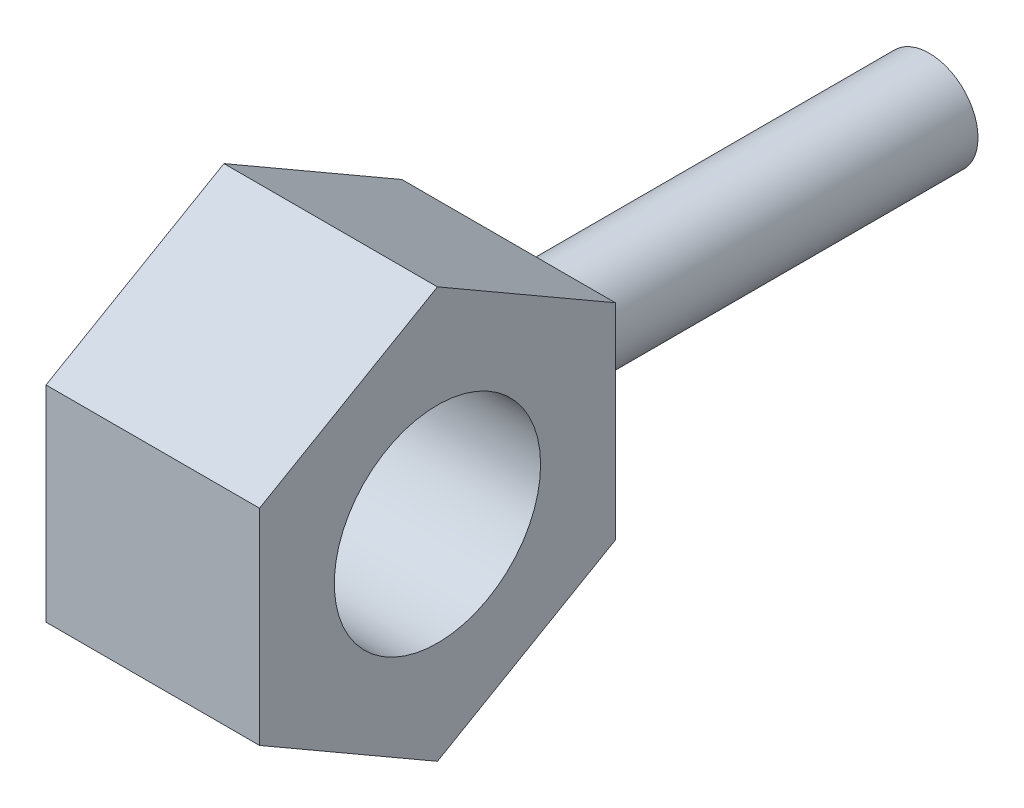
ISO-10303-21;
HEADER;
FILE_DESCRIPTION(('STEP AP214'),'2;1');
FILE_NAME('part.step','',(''),(''),'','','');
FILE_SCHEMA(('AUTOMOTIVE_DESIGN { 1 0 10303 214 1 1 1 1 }'));
ENDSEC;
DATA;
#1=APPLICATION_CONTEXT('core data for automotive mechanical design processes');
#2=APPLICATION_PROTOCOL_DEFINITION('international standard','automotive_design',2000,#1);
#3=PRODUCT_CONTEXT('',#1,'mechanical');
#4=PRODUCT('Part','Part','',(#3));
#5=PRODUCT_RELATED_PRODUCT_CATEGORY('part','',(#4));
#6=PRODUCT_DEFINITION_FORMATION('','',#4);
#7=PRODUCT_DEFINITION_CONTEXT('part definition',#1,'design');
#8=PRODUCT_DEFINITION('design','',#6,#7);
#9=PRODUCT_DEFINITION_SHAPE('','',#8);
#10=(LENGTH_UNIT() NAMED_UNIT(*) SI_UNIT(.MILLI.,.METRE.));
#11=(NAMED_UNIT(*) PLANE_ANGLE_UNIT() SI_UNIT($,.RADIAN.));
#12=(NAMED_UNIT(*) SI_UNIT($,.STERADIAN.) SOLID_ANGLE_UNIT());
#13=UNCERTAINTY_MEASURE_WITH_UNIT(LENGTH_MEASURE(1.E-05),#10,'distance_accuracy_value','');
#14=(GEOMETRIC_REPRESENTATION_CONTEXT(3) GLOBAL_UNCERTAINTY_ASSIGNED_CONTEXT((#13)) GLOBAL_UNIT_ASSIGNED_CONTEXT((#10,
#11,#12)) REPRESENTATION_CONTEXT('',''));
#15=CARTESIAN_POINT('',(0.,0.,0.));
#16=DIRECTION('',(0.,0.,1.));
#17=DIRECTION('',(1.,0.,0.));
#18=AXIS2_PLACEMENT_3D('',#15,#16,#17);
#19=CARTESIAN_POINT('',(30.,0.,0.));
#20=DIRECTION('',(1.,0.,0.));
#21=DIRECTION('',(0.,0.,-1.));
#22=AXIS2_PLACEMENT_3D('',#19,#20,#21);
#23=PLANE('',#22);
#24=DIRECTION('',(0.,1.,0.));
#25=VECTOR('',#24,1.);
#26=CARTESIAN_POINT('',(30.,-14.4337567297407,-25.));
#27=LINE('',#26,#25);
#28=CARTESIAN_POINT('',(30.,-14.4337567297407,-25.));
#29=VERTEX_POINT('',#28);
#30=CARTESIAN_POINT('',(30.,14.4337567297406,-25.));
#31=VERTEX_POINT('',#30);
#32=EDGE_CURVE('E130',#29,#31,#27,.T.);
#33=ORIENTED_EDGE('',*,*,#32,.T.);
#34=DIRECTION('',(0.,0.5,0.866025403784438));
#35=VECTOR('',#34,1.);
#36=CARTESIAN_POINT('',(30.,14.4337567297406,-25.));
#37=LINE('',#36,#35);
#38=CARTESIAN_POINT('',(30.,28.8675134594813,0.));
#39=VERTEX_POINT('',#38);
#40=EDGE_CURVE('E88',#31,#39,#37,.T.);
#41=ORIENTED_EDGE('',*,*,#40,.T.);
#42=DIRECTION('',(0.,-0.5,0.866025403784439));
#43=VECTOR('',#42,1.);
#44=CARTESIAN_POINT('',(30.,28.8675134594813,0.));
#45=LINE('',#44,#43);
#46=CARTESIAN_POINT('',(30.,14.4337567297407,25.));
#47=VERTEX_POINT('',#46);
#48=EDGE_CURVE('E101',#39,#47,#45,.T.);
#49=ORIENTED_EDGE('',*,*,#48,.T.);
#50=DIRECTION('',(0.,-1.,0.));
#51=VECTOR('',#50,1.);
#52=CARTESIAN_POINT('',(30.,14.4337567297407,25.));
#53=LINE('',#52,#51);
#54=CARTESIAN_POINT('',(30.,-14.4337567297406,25.));
#55=VERTEX_POINT('',#54);
#56=EDGE_CURVE('E95',#47,#55,#53,.T.);
#57=ORIENTED_EDGE('',*,*,#56,.T.);
#58=DIRECTION('',(0.,-0.5,-0.866025403784439));
#59=VECTOR('',#58,1.);
#60=CARTESIAN_POINT('',(30.,-14.4337567297406,25.));
#61=LINE('',#60,#59);
#62=CARTESIAN_POINT('',(30.,-28.8675134594813,0.));
#63=VERTEX_POINT('',#62);
#64=EDGE_CURVE('E99',#55,#63,#61,.T.);
#65=ORIENTED_EDGE('',*,*,#64,.T.);
#66=DIRECTION('',(0.,0.5,-0.866025403784439));
#67=VECTOR('',#66,1.);
#68=CARTESIAN_POINT('',(30.,-28.8675134594813,0.));
#69=LINE('',#68,#67);
#70=EDGE_CURVE('E50',#63,#29,#69,.T.);
#71=ORIENTED_EDGE('',*,*,#70,.T.);
#72=EDGE_LOOP('',(#33,#41,#49,#57,#65,#71));
#73=FACE_BOUND('',#72,.T.);
#74=CARTESIAN_POINT('',(30.,0.,0.));
#75=DIRECTION('',(1.,0.,0.));
#76=DIRECTION('',(0.,0.,-1.));
#77=AXIS2_PLACEMENT_3D('',#74,#75,#76);
#78=CIRCLE('',#77,14.4934105811326);
#79=CARTESIAN_POINT('',(30.,0.,-14.4934105811326));
#80=VERTEX_POINT('',#79);
#81=EDGE_CURVE('E123',#80,#80,#78,.T.);
#82=ORIENTED_EDGE('',*,*,#81,.F.);
#83=EDGE_LOOP('',(#82));
#84=FACE_BOUND('',#83,.T.);
#85=ADVANCED_FACE('F33',(#73,#84),#23,.T.);
#86=CARTESIAN_POINT('',(0.,0.,0.));
#87=DIRECTION('',(1.,0.,0.));
#88=DIRECTION('',(0.,0.,-1.));
#89=AXIS2_PLACEMENT_3D('',#86,#87,#88);
#90=PLANE('',#89);
#91=DIRECTION('',(0.,1.,0.));
#92=VECTOR('',#91,1.);
#93=CARTESIAN_POINT('',(0.,-14.4337567297407,-25.));
#94=LINE('',#93,#92);
#95=CARTESIAN_POINT('',(0.,-14.4337567297407,-25.));
#96=VERTEX_POINT('',#95);
#97=CARTESIAN_POINT('',(0.,14.4337567297406,-25.));
#98=VERTEX_POINT('',#97);
#99=EDGE_CURVE('E119',#96,#98,#94,.T.);
#100=ORIENTED_EDGE('',*,*,#99,.F.);
#101=DIRECTION('',(0.,0.5,-0.866025403784439));
#102=VECTOR('',#101,1.);
#103=CARTESIAN_POINT('',(0.,-28.8675134594813,0.));
#104=LINE('',#103,#102);
#105=CARTESIAN_POINT('',(0.,-28.8675134594813,0.));
#106=VERTEX_POINT('',#105);
#107=EDGE_CURVE('E79',#106,#96,#104,.T.);
#108=ORIENTED_EDGE('',*,*,#107,.F.);
#109=DIRECTION('',(0.,-0.5,-0.866025403784439));
#110=VECTOR('',#109,1.);
#111=CARTESIAN_POINT('',(0.,-14.4337567297406,25.));
#112=LINE('',#111,#110);
#113=CARTESIAN_POINT('',(0.,-14.4337567297406,25.));
#114=VERTEX_POINT('',#113);
#115=EDGE_CURVE('E73',#114,#106,#112,.T.);
#116=ORIENTED_EDGE('',*,*,#115,.F.);
#117=DIRECTION('',(0.,-1.,0.));
#118=VECTOR('',#117,1.);
#119=CARTESIAN_POINT('',(0.,14.4337567297407,25.));
#120=LINE('',#119,#118);
#121=CARTESIAN_POINT('',(0.,14.4337567297407,25.));
#122=VERTEX_POINT('',#121);
#123=EDGE_CURVE('E109',#122,#114,#120,.T.);
#124=ORIENTED_EDGE('',*,*,#123,.F.);
#125=DIRECTION('',(0.,-0.5,0.866025403784439));
#126=VECTOR('',#125,1.);
#127=CARTESIAN_POINT('',(0.,28.8675134594813,0.));
#128=LINE('',#127,#126);
#129=CARTESIAN_POINT('',(0.,28.8675134594813,0.));
#130=VERTEX_POINT('',#129);
#131=EDGE_CURVE('E125',#130,#122,#128,.T.);
#132=ORIENTED_EDGE('',*,*,#131,.F.);
#133=DIRECTION('',(0.,0.5,0.866025403784438));
#134=VECTOR('',#133,1.);
#135=CARTESIAN_POINT('',(0.,14.4337567297406,-25.));
#136=LINE('',#135,#134);
#137=EDGE_CURVE('E122',#98,#130,#136,.T.);
#138=ORIENTED_EDGE('',*,*,#137,.F.);
#139=EDGE_LOOP('',(#100,#108,#116,#124,#132,#138));
#140=FACE_BOUND('',#139,.T.);
#141=CARTESIAN_POINT('',(0.,0.,0.));
#142=DIRECTION('',(1.,0.,0.));
#143=DIRECTION('',(0.,0.,-1.));
#144=AXIS2_PLACEMENT_3D('',#141,#142,#143);
#145=CIRCLE('',#144,14.4934105811326);
#146=CARTESIAN_POINT('',(0.,0.,-14.4934105811326));
#147=VERTEX_POINT('',#146);
#148=EDGE_CURVE('E150',#147,#147,#145,.T.);
#149=ORIENTED_EDGE('',*,*,#148,.T.);
#150=EDGE_LOOP('',(#149));
#151=FACE_BOUND('',#150,.T.);
#152=ADVANCED_FACE('F142',(#140,#151),#90,.F.);
#153=CARTESIAN_POINT('',(30.,-14.4337567297407,-25.));
#154=DIRECTION('',(0.,0.,1.));
#155=DIRECTION('',(0.,-1.,0.));
#156=AXIS2_PLACEMENT_3D('',#153,#154,#155);
#157=PLANE('',#156);
#158=CARTESIAN_POINT('',(14.0993466361134,0.,-25.));
#159=DIRECTION('',(0.,0.,1.));
#160=DIRECTION('',(0.,-1.,0.));
#161=AXIS2_PLACEMENT_3D('',#158,#159,#160);
#162=CIRCLE('',#161,6.84972065406715);
#163=CARTESIAN_POINT('',(20.9490672901806,0.,-25.));
#164=VERTEX_POINT('',#163);
#165=EDGE_CURVE('E11',#164,#164,#162,.F.);
#166=ORIENTED_EDGE('',*,*,#165,.F.);
#167=EDGE_LOOP('',(#166));
#168=FACE_BOUND('',#167,.T.);
#169=ORIENTED_EDGE('',*,*,#99,.T.);
#170=DIRECTION('',(-1.,0.,0.));
#171=VECTOR('',#170,1.);
#172=CARTESIAN_POINT('',(30.,14.4337567297406,-25.));
#173=LINE('',#172,#171);
#174=EDGE_CURVE('E42',#31,#98,#173,.T.);
#175=ORIENTED_EDGE('',*,*,#174,.F.);
#176=ORIENTED_EDGE('',*,*,#32,.F.);
#177=DIRECTION('',(-1.,0.,0.));
#178=VECTOR('',#177,1.);
#179=CARTESIAN_POINT('',(30.,-14.4337567297407,-25.));
#180=LINE('',#179,#178);
#181=EDGE_CURVE('E115',#29,#96,#180,.T.);
#182=ORIENTED_EDGE('',*,*,#181,.T.);
#183=EDGE_LOOP('',(#169,#175,#176,#182));
#184=FACE_BOUND('',#183,.T.);
#185=ADVANCED_FACE('F35',(#168,#184),#157,.F.);
#186=CARTESIAN_POINT('',(30.,14.4337567297406,-25.));
#187=DIRECTION('',(0.,-0.866025403784438,0.5));
#188=DIRECTION('',(0.,-0.5,-0.866025403784439));
#189=AXIS2_PLACEMENT_3D('',#186,#187,#188);
#190=PLANE('',#189);
#191=ORIENTED_EDGE('',*,*,#137,.T.);
#192=DIRECTION('',(-1.,0.,0.));
#193=VECTOR('',#192,1.);
#194=CARTESIAN_POINT('',(30.,28.8675134594813,0.));
#195=LINE('',#194,#193);
#196=EDGE_CURVE('E134',#39,#130,#195,.T.);
#197=ORIENTED_EDGE('',*,*,#196,.F.);
#198=ORIENTED_EDGE('',*,*,#40,.F.);
#199=ORIENTED_EDGE('',*,*,#174,.T.);
#200=EDGE_LOOP('',(#191,#197,#198,#199));
#201=FACE_BOUND('',#200,.T.);
#202=ADVANCED_FACE('F137',(#201),#190,.F.);
#203=CARTESIAN_POINT('',(30.,28.8675134594813,0.));
#204=DIRECTION('',(0.,-0.866025403784439,-0.5));
#205=DIRECTION('',(0.,0.5,-0.866025403784439));
#206=AXIS2_PLACEMENT_3D('',#203,#204,#205);
#207=PLANE('',#206);
#208=ORIENTED_EDGE('',*,*,#131,.T.);
#209=DIRECTION('',(-1.,0.,0.));
#210=VECTOR('',#209,1.);
#211=CARTESIAN_POINT('',(30.,14.4337567297407,25.));
#212=LINE('',#211,#210);
#213=EDGE_CURVE('E110',#47,#122,#212,.T.);
#214=ORIENTED_EDGE('',*,*,#213,.F.);
#215=ORIENTED_EDGE('',*,*,#48,.F.);
#216=ORIENTED_EDGE('',*,*,#196,.T.);
#217=EDGE_LOOP('',(#208,#214,#215,#216));
#218=FACE_BOUND('',#217,.T.);
#219=ADVANCED_FACE('F146',(#218),#207,.F.);
#220=CARTESIAN_POINT('',(30.,14.4337567297407,25.));
#221=DIRECTION('',(0.,0.,-1.));
#222=DIRECTION('',(0.,1.,0.));
#223=AXIS2_PLACEMENT_3D('',#220,#221,#222);
#224=PLANE('',#223);
#225=ORIENTED_EDGE('',*,*,#123,.T.);
#226=DIRECTION('',(-1.,0.,0.));
#227=VECTOR('',#226,1.);
#228=CARTESIAN_POINT('',(30.,-14.4337567297406,25.));
#229=LINE('',#228,#227);
#230=EDGE_CURVE('E106',#55,#114,#229,.T.);
#231=ORIENTED_EDGE('',*,*,#230,.F.);
#232=ORIENTED_EDGE('',*,*,#56,.F.);
#233=ORIENTED_EDGE('',*,*,#213,.T.);
#234=EDGE_LOOP('',(#225,#231,#232,#233));
#235=FACE_BOUND('',#234,.T.);
#236=ADVANCED_FACE('F107',(#235),#224,.F.);
#237=CARTESIAN_POINT('',(30.,-14.4337567297406,25.));
#238=DIRECTION('',(0.,0.866025403784438,-0.5));
#239=DIRECTION('',(0.,0.5,0.866025403784439));
#240=AXIS2_PLACEMENT_3D('',#237,#238,#239);
#241=PLANE('',#240);
#242=ORIENTED_EDGE('',*,*,#115,.T.);
#243=DIRECTION('',(-1.,0.,0.));
#244=VECTOR('',#243,1.);
#245=CARTESIAN_POINT('',(30.,-28.8675134594813,0.));
#246=LINE('',#245,#244);
#247=EDGE_CURVE('E111',#63,#106,#246,.T.);
#248=ORIENTED_EDGE('',*,*,#247,.F.);
#249=ORIENTED_EDGE('',*,*,#64,.F.);
#250=ORIENTED_EDGE('',*,*,#230,.T.);
#251=EDGE_LOOP('',(#242,#248,#249,#250));
#252=FACE_BOUND('',#251,.T.);
#253=ADVANCED_FACE('F113',(#252),#241,.F.);
#254=CARTESIAN_POINT('',(30.,-28.8675134594813,0.));
#255=DIRECTION('',(0.,0.866025403784439,0.5));
#256=DIRECTION('',(0.,-0.5,0.866025403784439));
#257=AXIS2_PLACEMENT_3D('',#254,#255,#256);
#258=PLANE('',#257);
#259=ORIENTED_EDGE('',*,*,#107,.T.);
#260=ORIENTED_EDGE('',*,*,#181,.F.);
#261=ORIENTED_EDGE('',*,*,#70,.F.);
#262=ORIENTED_EDGE('',*,*,#247,.T.);
#263=EDGE_LOOP('',(#259,#260,#261,#262));
#264=FACE_BOUND('',#263,.T.);
#265=ADVANCED_FACE('F180',(#264),#258,.F.);
#266=CARTESIAN_POINT('',(30.,0.,0.));
#267=DIRECTION('',(-1.,0.,0.));
#268=DIRECTION('',(0.,0.,1.));
#269=AXIS2_PLACEMENT_3D('',#266,#267,#268);
#270=CYLINDRICAL_SURFACE('',#269,14.4934105811326);
#271=ORIENTED_EDGE('',*,*,#81,.T.);
#272=EDGE_LOOP('',(#271));
#273=FACE_BOUND('',#272,.T.);
#274=ORIENTED_EDGE('',*,*,#148,.F.);
#275=EDGE_LOOP('',(#274));
#276=FACE_BOUND('',#275,.T.);
#277=ADVANCED_FACE('F164',(#273,#276),#270,.F.);
#278=CARTESIAN_POINT('',(14.0993466361134,0.,-85.));
#279=DIRECTION('',(0.,0.,1.));
#280=DIRECTION('',(1.,0.,0.));
#281=AXIS2_PLACEMENT_3D('',#278,#279,#280);
#282=CYLINDRICAL_SURFACE('',#281,6.84972065406715);
#283=CARTESIAN_POINT('',(14.0993466361134,0.,-85.));
#284=DIRECTION('',(0.,0.,-1.));
#285=DIRECTION('',(-1.,0.,0.));
#286=AXIS2_PLACEMENT_3D('',#283,#284,#285);
#287=CIRCLE('',#286,6.84972065406715);
#288=CARTESIAN_POINT('',(20.9490672901806,0.,-85.));
#289=VERTEX_POINT('',#288);
#290=EDGE_CURVE('E153',#289,#289,#287,.T.);
#291=CARTESIAN_POINT('',(20.9490672901806,0.,-85.));
#292=CARTESIAN_POINT('',(20.9490672901806,0.,-84.375));
#293=CARTESIAN_POINT('',(20.9490672901806,0.,-83.75));
#294=CARTESIAN_POINT('',(20.9490672901806,0.,-82.5));
#295=CARTESIAN_POINT('',(20.9490672901806,0.,-81.875));
#296=CARTESIAN_POINT('',(20.9490672901806,0.,-80.625));
#297=CARTESIAN_POINT('',(20.9490672901806,0.,-80.));
#298=CARTESIAN_POINT('',(20.9490672901806,0.,-78.75));
#299=CARTESIAN_POINT('',(20.9490672901806,0.,-78.125));
#300=CARTESIAN_POINT('',(20.9490672901806,0.,-76.875));
#301=CARTESIAN_POINT('',(20.9490672901806,0.,-76.25));
#302=CARTESIAN_POINT('',(20.9490672901806,0.,-75.));
#303=CARTESIAN_POINT('',(20.9490672901806,0.,-74.375));
#304=CARTESIAN_POINT('',(20.9490672901806,0.,-73.125));
#305=CARTESIAN_POINT('',(20.9490672901806,0.,-72.5));
#306=CARTESIAN_POINT('',(20.9490672901806,0.,-71.25));
#307=CARTESIAN_POINT('',(20.9490672901806,0.,-70.625));
#308=CARTESIAN_POINT('',(20.9490672901806,0.,-69.375));
#309=CARTESIAN_POINT('',(20.9490672901806,0.,-68.75));
#310=CARTESIAN_POINT('',(20.9490672901806,0.,-67.5));
#311=CARTESIAN_POINT('',(20.9490672901806,0.,-66.875));
#312=CARTESIAN_POINT('',(20.9490672901806,0.,-65.625));
#313=CARTESIAN_POINT('',(20.9490672901806,0.,-65.));
#314=CARTESIAN_POINT('',(20.9490672901806,0.,-63.75));
#315=CARTESIAN_POINT('',(20.9490672901806,0.,-63.125));
#316=CARTESIAN_POINT('',(20.9490672901806,0.,-61.875));
#317=CARTESIAN_POINT('',(20.9490672901806,0.,-61.25));
#318=CARTESIAN_POINT('',(20.9490672901806,0.,-60.));
#319=CARTESIAN_POINT('',(20.9490672901806,0.,-59.375));
#320=CARTESIAN_POINT('',(20.9490672901806,0.,-58.125));
#321=CARTESIAN_POINT('',(20.9490672901806,0.,-57.5));
#322=CARTESIAN_POINT('',(20.9490672901806,0.,-56.25));
#323=CARTESIAN_POINT('',(20.9490672901806,0.,-55.625));
#324=CARTESIAN_POINT('',(20.9490672901806,0.,-54.375));
#325=CARTESIAN_POINT('',(20.9490672901806,0.,-53.75));
#326=CARTESIAN_POINT('',(20.9490672901806,0.,-52.5));
#327=CARTESIAN_POINT('',(20.9490672901806,0.,-51.875));
#328=CARTESIAN_POINT('',(20.9490672901806,0.,-50.625));
#329=CARTESIAN_POINT('',(20.9490672901806,0.,-50.));
#330=CARTESIAN_POINT('',(20.9490672901806,0.,-48.75));
#331=CARTESIAN_POINT('',(20.9490672901806,0.,-48.125));
#332=CARTESIAN_POINT('',(20.9490672901806,0.,-46.875));
#333=CARTESIAN_POINT('',(20.9490672901806,0.,-46.25));
#334=CARTESIAN_POINT('',(20.9490672901806,0.,-45.));
#335=CARTESIAN_POINT('',(20.9490672901806,0.,-44.375));
#336=CARTESIAN_POINT('',(20.9490672901806,0.,-43.125));
#337=CARTESIAN_POINT('',(20.9490672901806,0.,-42.5));
#338=CARTESIAN_POINT('',(20.9490672901806,0.,-41.25));
#339=CARTESIAN_POINT('',(20.9490672901806,0.,-40.625));
#340=CARTESIAN_POINT('',(20.9490672901806,0.,-39.375));
#341=CARTESIAN_POINT('',(20.9490672901806,0.,-38.75));
#342=CARTESIAN_POINT('',(20.9490672901806,0.,-37.5));
#343=CARTESIAN_POINT('',(20.9490672901806,0.,-36.875));
#344=CARTESIAN_POINT('',(20.9490672901806,0.,-35.625));
#345=CARTESIAN_POINT('',(20.9490672901806,0.,-35.));
#346=CARTESIAN_POINT('',(20.9490672901806,0.,-33.75));
#347=CARTESIAN_POINT('',(20.9490672901806,0.,-33.125));
#348=CARTESIAN_POINT('',(20.9490672901806,0.,-31.875));
#349=CARTESIAN_POINT('',(20.9490672901806,0.,-31.25));
#350=CARTESIAN_POINT('',(20.9490672901806,0.,-30.));
#351=CARTESIAN_POINT('',(20.9490672901806,0.,-29.375));
#352=CARTESIAN_POINT('',(20.9490672901806,0.,-28.125));
#353=CARTESIAN_POINT('',(20.9490672901806,0.,-27.5));
#354=CARTESIAN_POINT('',(20.9490672901806,0.,-26.25));
#355=CARTESIAN_POINT('',(20.9490672901806,0.,-25.625));
#356=CARTESIAN_POINT('',(20.9490672901806,0.,-25.));
#357=B_SPLINE_CURVE_WITH_KNOTS('',3,(#291,#292,#293,#294,#295,#296,#297,#298,#299,#300,#301,
#302,#303,#304,#305,#306,#307,#308,#309,#310,#311,#312,#313,#314,#315,#316,#317,#318,#319,#320,
#321,#322,#323,#324,#325,#326,#327,#328,#329,#330,#331,#332,#333,#334,#335,#336,#337,#338,#339,
#340,#341,#342,#343,#344,#345,#346,#347,#348,#349,#350,#351,#352,#353,#354,#355,#356),
.UNSPECIFIED.,.F.,.F.,(4,2,2,2,2,2,2,2,2,2,2,2,2,2,2,2,2,2,2,2,2,2,2,2,2,2,2,2,2,2,2,2,4),(0.,
1.875,3.75,5.62500000000001,7.50000000000001,9.37500000000001,11.25,13.125,15.,16.875,18.75,
20.625,22.5,24.375,26.25,28.125,30.,31.875,33.75,35.625,37.5,39.375,41.25,43.125,45.,46.875,
48.75,50.625,52.5,54.375,56.25,58.125,60.),.UNSPECIFIED.);
#358=EDGE_CURVE('BSEAM161',#289,#164,#357,.T.);
#359=ORIENTED_EDGE('',*,*,#290,.F.);
#360=ORIENTED_EDGE('',*,*,#165,.T.);
#361=ORIENTED_EDGE('',*,*,#358,.T.);
#362=ORIENTED_EDGE('',*,*,#358,.F.);
#363=EDGE_LOOP('',(#359,#361,#360,#362));
#364=FACE_BOUND('',#363,.T.);
#365=ADVANCED_FACE('F161',(#364),#282,.T.);
#366=CARTESIAN_POINT('',(14.0993466361134,0.,-85.));
#367=DIRECTION('',(0.,0.,-1.));
#368=DIRECTION('',(-1.,0.,0.));
#369=AXIS2_PLACEMENT_3D('',#366,#367,#368);
#370=PLANE('',#369);
#371=ORIENTED_EDGE('',*,*,#290,.T.);
#372=EDGE_LOOP('',(#371));
#373=FACE_BOUND('',#372,.T.);
#374=ADVANCED_FACE('F159',(#373),#370,.T.);
#375=CLOSED_SHELL('',(#85,#152,#185,#202,#219,#236,#253,#265,#277,#365,#374));
#376=MANIFOLD_SOLID_BREP('B2',#375);
#377=ADVANCED_BREP_SHAPE_REPRESENTATION('',(#18,#376),#14);
#378=SHAPE_DEFINITION_REPRESENTATION(#9,#377);
ENDSEC;
END-ISO-10303-21;
